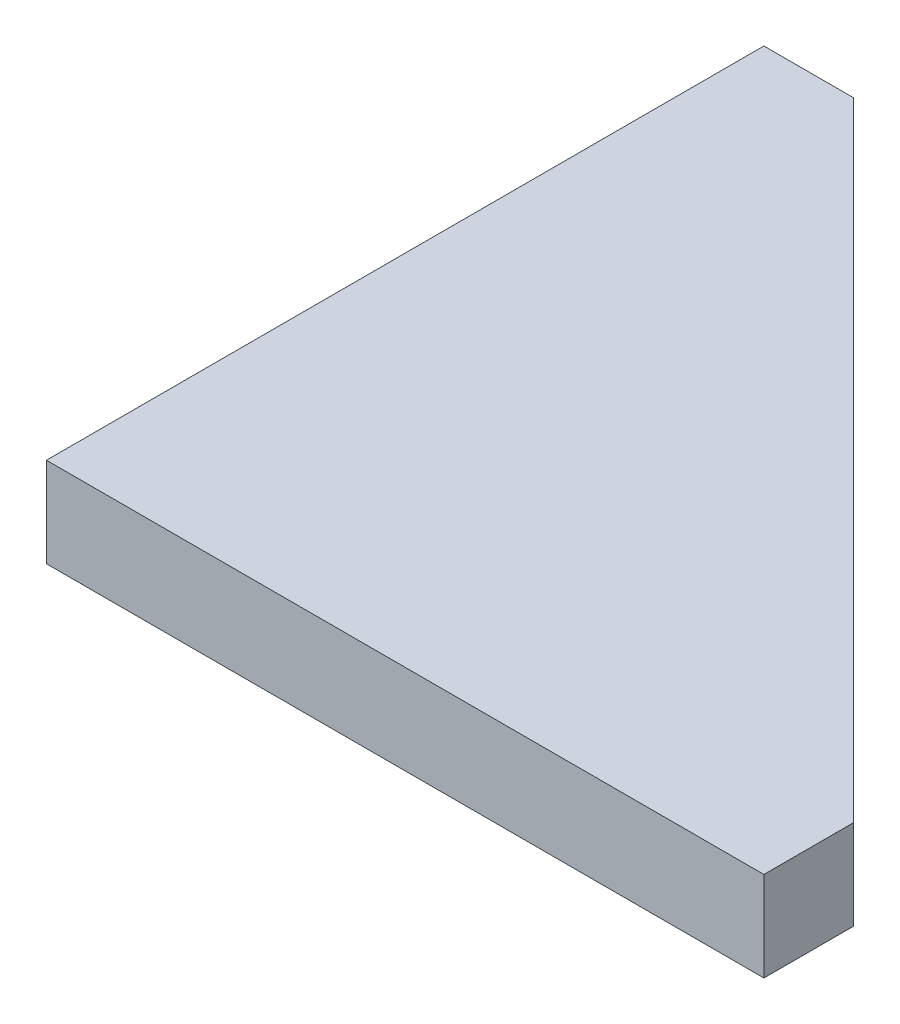
ISO-10303-21;
HEADER;
FILE_DESCRIPTION(('STEP AP214'),'2;1');
FILE_NAME('part.step','',(''),(''),'','','');
FILE_SCHEMA(('AUTOMOTIVE_DESIGN { 1 0 10303 214 1 1 1 1 }'));
ENDSEC;
DATA;
#1=APPLICATION_CONTEXT('core data for automotive mechanical design processes');
#2=APPLICATION_PROTOCOL_DEFINITION('international standard','automotive_design',2000,#1);
#3=PRODUCT_CONTEXT('',#1,'mechanical');
#4=PRODUCT('Part','Part','',(#3));
#5=PRODUCT_RELATED_PRODUCT_CATEGORY('part','',(#4));
#6=PRODUCT_DEFINITION_FORMATION('','',#4);
#7=PRODUCT_DEFINITION_CONTEXT('part definition',#1,'design');
#8=PRODUCT_DEFINITION('design','',#6,#7);
#9=PRODUCT_DEFINITION_SHAPE('','',#8);
#10=(LENGTH_UNIT() NAMED_UNIT(*) SI_UNIT(.MILLI.,.METRE.));
#11=(NAMED_UNIT(*) PLANE_ANGLE_UNIT() SI_UNIT($,.RADIAN.));
#12=(NAMED_UNIT(*) SI_UNIT($,.STERADIAN.) SOLID_ANGLE_UNIT());
#13=UNCERTAINTY_MEASURE_WITH_UNIT(LENGTH_MEASURE(1.E-05),#10,'distance_accuracy_value','');
#14=(GEOMETRIC_REPRESENTATION_CONTEXT(3) GLOBAL_UNCERTAINTY_ASSIGNED_CONTEXT((#13)) GLOBAL_UNIT_ASSIGNED_CONTEXT((#10,
#11,#12)) REPRESENTATION_CONTEXT('',''));
#15=CARTESIAN_POINT('',(0.,0.,0.));
#16=DIRECTION('',(0.,0.,1.));
#17=DIRECTION('',(1.,0.,0.));
#18=AXIS2_PLACEMENT_3D('',#15,#16,#17);
#19=CARTESIAN_POINT('',(0.,9.525,0.));
#20=DIRECTION('',(0.,0.,-1.));
#21=DIRECTION('',(-1.,0.,0.));
#22=AXIS2_PLACEMENT_3D('',#19,#20,#21);
#23=PLANE('',#22);
#24=DIRECTION('',(1.,0.,0.));
#25=VECTOR('',#24,1.);
#26=CARTESIAN_POINT('',(0.,0.,0.));
#27=LINE('',#26,#25);
#28=CARTESIAN_POINT('',(0.,0.,0.));
#29=VERTEX_POINT('',#28);
#30=CARTESIAN_POINT('',(76.2,0.,0.));
#31=VERTEX_POINT('',#30);
#32=EDGE_CURVE('E61',#29,#31,#27,.T.);
#33=ORIENTED_EDGE('',*,*,#32,.T.);
#34=DIRECTION('',(0.,-1.,0.));
#35=VECTOR('',#34,1.);
#36=CARTESIAN_POINT('',(76.2,9.525,0.));
#37=LINE('',#36,#35);
#38=CARTESIAN_POINT('',(76.2,9.525,0.));
#39=VERTEX_POINT('',#38);
#40=EDGE_CURVE('E11',#39,#31,#37,.T.);
#41=ORIENTED_EDGE('',*,*,#40,.F.);
#42=DIRECTION('',(1.,0.,0.));
#43=VECTOR('',#42,1.);
#44=CARTESIAN_POINT('',(0.,9.525,0.));
#45=LINE('',#44,#43);
#46=CARTESIAN_POINT('',(0.,9.525,0.));
#47=VERTEX_POINT('',#46);
#48=EDGE_CURVE('E79',#47,#39,#45,.T.);
#49=ORIENTED_EDGE('',*,*,#48,.F.);
#50=DIRECTION('',(0.,-1.,0.));
#51=VECTOR('',#50,1.);
#52=CARTESIAN_POINT('',(0.,9.525,0.));
#53=LINE('',#52,#51);
#54=EDGE_CURVE('E110',#47,#29,#53,.T.);
#55=ORIENTED_EDGE('',*,*,#54,.T.);
#56=EDGE_LOOP('',(#33,#41,#49,#55));
#57=FACE_BOUND('',#56,.T.);
#58=ADVANCED_FACE('F33',(#57),#23,.F.);
#59=CARTESIAN_POINT('',(0.,9.525,0.));
#60=DIRECTION('',(1.,0.,0.));
#61=DIRECTION('',(0.,0.,-1.));
#62=AXIS2_PLACEMENT_3D('',#59,#60,#61);
#63=PLANE('',#62);
#64=DIRECTION('',(0.,0.,1.));
#65=VECTOR('',#64,1.);
#66=CARTESIAN_POINT('',(0.,0.,0.));
#67=LINE('',#66,#65);
#68=CARTESIAN_POINT('',(0.,0.,-76.2));
#69=VERTEX_POINT('',#68);
#70=EDGE_CURVE('E85',#69,#29,#67,.T.);
#71=ORIENTED_EDGE('',*,*,#70,.T.);
#72=ORIENTED_EDGE('',*,*,#54,.F.);
#73=DIRECTION('',(0.,0.,1.));
#74=VECTOR('',#73,1.);
#75=CARTESIAN_POINT('',(0.,9.525,0.));
#76=LINE('',#75,#74);
#77=CARTESIAN_POINT('',(0.,9.525,-76.2));
#78=VERTEX_POINT('',#77);
#79=EDGE_CURVE('E49',#78,#47,#76,.T.);
#80=ORIENTED_EDGE('',*,*,#79,.F.);
#81=DIRECTION('',(0.,-1.,0.));
#82=VECTOR('',#81,1.);
#83=CARTESIAN_POINT('',(0.,9.525,-76.2));
#84=LINE('',#83,#82);
#85=EDGE_CURVE('E41',#78,#69,#84,.T.);
#86=ORIENTED_EDGE('',*,*,#85,.T.);
#87=EDGE_LOOP('',(#71,#72,#80,#86));
#88=FACE_BOUND('',#87,.T.);
#89=ADVANCED_FACE('F116',(#88),#63,.F.);
#90=CARTESIAN_POINT('',(0.,9.525,0.));
#91=DIRECTION('',(0.,1.,0.));
#92=DIRECTION('',(0.,0.,1.));
#93=AXIS2_PLACEMENT_3D('',#90,#91,#92);
#94=PLANE('',#93);
#95=ORIENTED_EDGE('',*,*,#48,.T.);
#96=DIRECTION('',(0.,0.,-1.));
#97=VECTOR('',#96,1.);
#98=CARTESIAN_POINT('',(76.2,9.525,0.));
#99=LINE('',#98,#97);
#100=CARTESIAN_POINT('',(76.2,9.525,-9.525));
#101=VERTEX_POINT('',#100);
#102=EDGE_CURVE('E84',#39,#101,#99,.T.);
#103=ORIENTED_EDGE('',*,*,#102,.T.);
#104=DIRECTION('',(-0.707106781186548,0.,-0.707106781186548));
#105=VECTOR('',#104,1.);
#106=CARTESIAN_POINT('',(76.2,9.525,-9.525));
#107=LINE('',#106,#105);
#108=CARTESIAN_POINT('',(9.525,9.525,-76.2));
#109=VERTEX_POINT('',#108);
#110=EDGE_CURVE('E94',#101,#109,#107,.T.);
#111=ORIENTED_EDGE('',*,*,#110,.T.);
#112=DIRECTION('',(-1.,0.,0.));
#113=VECTOR('',#112,1.);
#114=CARTESIAN_POINT('',(0.,9.525,-76.2));
#115=LINE('',#114,#113);
#116=EDGE_CURVE('E96',#109,#78,#115,.T.);
#117=ORIENTED_EDGE('',*,*,#116,.T.);
#118=ORIENTED_EDGE('',*,*,#79,.T.);
#119=EDGE_LOOP('',(#95,#103,#111,#117,#118));
#120=FACE_BOUND('',#119,.T.);
#121=ADVANCED_FACE('F80',(#120),#94,.T.);
#122=CARTESIAN_POINT('',(0.,0.,0.));
#123=DIRECTION('',(0.,1.,0.));
#124=DIRECTION('',(0.,0.,1.));
#125=AXIS2_PLACEMENT_3D('',#122,#123,#124);
#126=PLANE('',#125);
#127=ORIENTED_EDGE('',*,*,#32,.F.);
#128=ORIENTED_EDGE('',*,*,#70,.F.);
#129=DIRECTION('',(1.,0.,0.));
#130=VECTOR('',#129,1.);
#131=CARTESIAN_POINT('',(0.,0.,-76.2));
#132=LINE('',#131,#130);
#133=CARTESIAN_POINT('',(9.52500000000001,0.,-76.2));
#134=VERTEX_POINT('',#133);
#135=EDGE_CURVE('E71',#69,#134,#132,.T.);
#136=ORIENTED_EDGE('',*,*,#135,.T.);
#137=DIRECTION('',(0.707106781186548,0.,0.707106781186548));
#138=VECTOR('',#137,1.);
#139=CARTESIAN_POINT('',(76.2,0.,-9.525));
#140=LINE('',#139,#138);
#141=CARTESIAN_POINT('',(76.2,0.,-9.525));
#142=VERTEX_POINT('',#141);
#143=EDGE_CURVE('E105',#134,#142,#140,.T.);
#144=ORIENTED_EDGE('',*,*,#143,.T.);
#145=DIRECTION('',(0.,0.,1.));
#146=VECTOR('',#145,1.);
#147=CARTESIAN_POINT('',(76.2,0.,0.));
#148=LINE('',#147,#146);
#149=EDGE_CURVE('E107',#142,#31,#148,.T.);
#150=ORIENTED_EDGE('',*,*,#149,.T.);
#151=EDGE_LOOP('',(#127,#128,#136,#144,#150));
#152=FACE_BOUND('',#151,.T.);
#153=ADVANCED_FACE('F121',(#152),#126,.F.);
#154=CARTESIAN_POINT('',(0.,-107.76307345283,-76.2));
#155=DIRECTION('',(0.,0.,-1.));
#156=DIRECTION('',(-1.,0.,0.));
#157=AXIS2_PLACEMENT_3D('',#154,#155,#156);
#158=PLANE('',#157);
#159=ORIENTED_EDGE('',*,*,#135,.F.);
#160=ORIENTED_EDGE('',*,*,#85,.F.);
#161=ORIENTED_EDGE('',*,*,#116,.F.);
#162=DIRECTION('',(0.,1.,0.));
#163=VECTOR('',#162,1.);
#164=CARTESIAN_POINT('',(9.525,-107.76307345283,-76.2));
#165=LINE('',#164,#163);
#166=EDGE_CURVE('E102',#134,#109,#165,.T.);
#167=ORIENTED_EDGE('',*,*,#166,.F.);
#168=EDGE_LOOP('',(#159,#160,#161,#167));
#169=FACE_BOUND('',#168,.T.);
#170=ADVANCED_FACE('F120',(#169),#158,.T.);
#171=CARTESIAN_POINT('',(76.2,-107.76307345283,-9.525));
#172=DIRECTION('',(0.707106781186548,0.,-0.707106781186548));
#173=DIRECTION('',(-0.707106781186548,0.,-0.707106781186548));
#174=AXIS2_PLACEMENT_3D('',#171,#172,#173);
#175=PLANE('',#174);
#176=ORIENTED_EDGE('',*,*,#143,.F.);
#177=ORIENTED_EDGE('',*,*,#166,.T.);
#178=ORIENTED_EDGE('',*,*,#110,.F.);
#179=DIRECTION('',(0.,1.,0.));
#180=VECTOR('',#179,1.);
#181=CARTESIAN_POINT('',(76.2,-107.76307345283,-9.525));
#182=LINE('',#181,#180);
#183=EDGE_CURVE('E92',#142,#101,#182,.T.);
#184=ORIENTED_EDGE('',*,*,#183,.F.);
#185=EDGE_LOOP('',(#176,#177,#178,#184));
#186=FACE_BOUND('',#185,.T.);
#187=ADVANCED_FACE('F124',(#186),#175,.T.);
#188=CARTESIAN_POINT('',(76.2,-107.76307345283,0.));
#189=DIRECTION('',(1.,0.,0.));
#190=DIRECTION('',(0.,0.,-1.));
#191=AXIS2_PLACEMENT_3D('',#188,#189,#190);
#192=PLANE('',#191);
#193=ORIENTED_EDGE('',*,*,#149,.F.);
#194=ORIENTED_EDGE('',*,*,#183,.T.);
#195=ORIENTED_EDGE('',*,*,#102,.F.);
#196=ORIENTED_EDGE('',*,*,#40,.T.);
#197=EDGE_LOOP('',(#193,#194,#195,#196));
#198=FACE_BOUND('',#197,.T.);
#199=ADVANCED_FACE('F90',(#198),#192,.T.);
#200=CLOSED_SHELL('',(#58,#89,#121,#153,#170,#187,#199));
#201=MANIFOLD_SOLID_BREP('B2',#200);
#202=ADVANCED_BREP_SHAPE_REPRESENTATION('',(#18,#201),#14);
#203=SHAPE_DEFINITION_REPRESENTATION(#9,#202);
ENDSEC;
END-ISO-10303-21;
